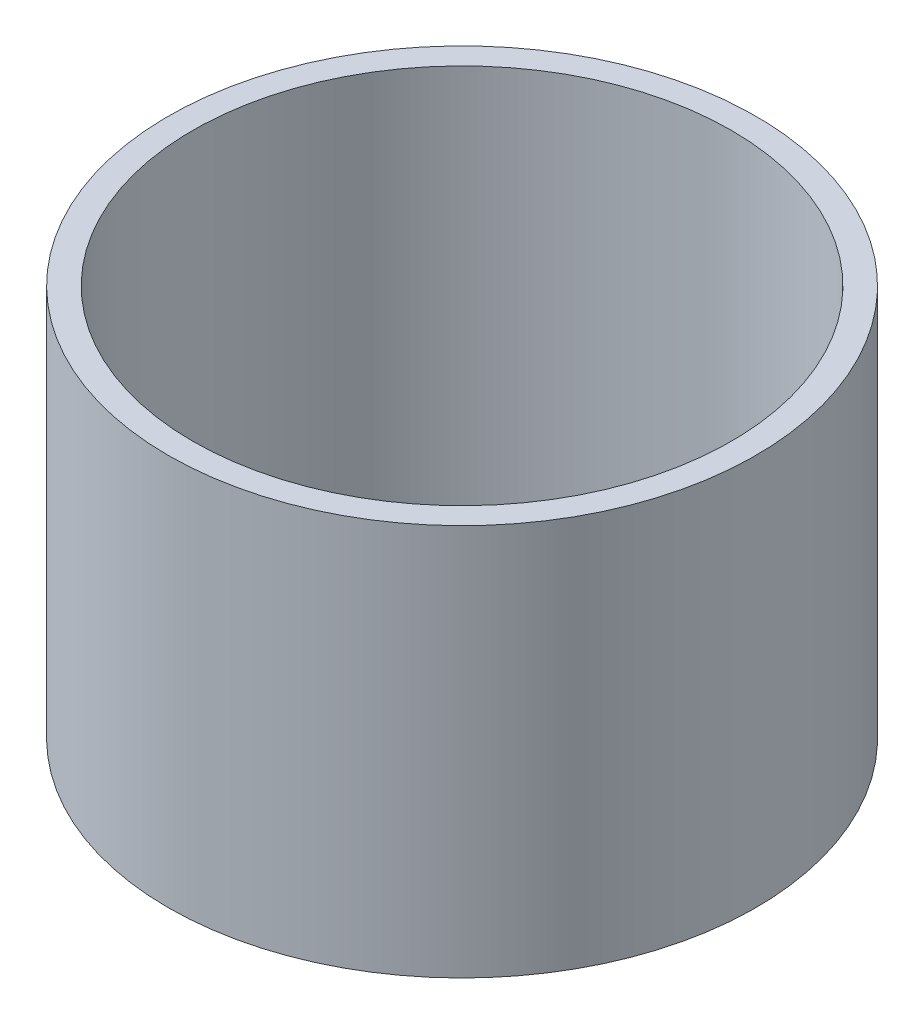
ISO-10303-21;
HEADER;
FILE_DESCRIPTION(('STEP AP214'),'2;1');
FILE_NAME('part.step','',(''),(''),'','','');
FILE_SCHEMA(('AUTOMOTIVE_DESIGN { 1 0 10303 214 1 1 1 1 }'));
ENDSEC;
DATA;
#1=APPLICATION_CONTEXT('core data for automotive mechanical design processes');
#2=APPLICATION_PROTOCOL_DEFINITION('international standard','automotive_design',2000,#1);
#3=PRODUCT_CONTEXT('',#1,'mechanical');
#4=PRODUCT('Part','Part','',(#3));
#5=PRODUCT_RELATED_PRODUCT_CATEGORY('part','',(#4));
#6=PRODUCT_DEFINITION_FORMATION('','',#4);
#7=PRODUCT_DEFINITION_CONTEXT('part definition',#1,'design');
#8=PRODUCT_DEFINITION('design','',#6,#7);
#9=PRODUCT_DEFINITION_SHAPE('','',#8);
#10=(LENGTH_UNIT() NAMED_UNIT(*) SI_UNIT(.MILLI.,.METRE.));
#11=(NAMED_UNIT(*) PLANE_ANGLE_UNIT() SI_UNIT($,.RADIAN.));
#12=(NAMED_UNIT(*) SI_UNIT($,.STERADIAN.) SOLID_ANGLE_UNIT());
#13=UNCERTAINTY_MEASURE_WITH_UNIT(LENGTH_MEASURE(1.E-05),#10,'distance_accuracy_value','');
#14=(GEOMETRIC_REPRESENTATION_CONTEXT(3) GLOBAL_UNCERTAINTY_ASSIGNED_CONTEXT((#13)) GLOBAL_UNIT_ASSIGNED_CONTEXT((#10,
#11,#12)) REPRESENTATION_CONTEXT('',''));
#15=CARTESIAN_POINT('',(0.,0.,0.));
#16=DIRECTION('',(0.,0.,1.));
#17=DIRECTION('',(1.,0.,0.));
#18=AXIS2_PLACEMENT_3D('',#15,#16,#17);
#19=CARTESIAN_POINT('',(0.,80.,0.));
#20=DIRECTION('',(0.,1.,0.));
#21=DIRECTION('',(0.,0.,1.));
#22=AXIS2_PLACEMENT_3D('',#19,#20,#21);
#23=PLANE('',#22);
#24=CARTESIAN_POINT('',(0.,80.,0.));
#25=DIRECTION('',(0.,1.,0.));
#26=DIRECTION('',(0.,0.,1.));
#27=AXIS2_PLACEMENT_3D('',#24,#25,#26);
#28=CIRCLE('',#27,60.);
#29=CARTESIAN_POINT('',(0.,80.,60.));
#30=VERTEX_POINT('',#29);
#31=EDGE_CURVE('E10',#30,#30,#28,.T.);
#32=ORIENTED_EDGE('',*,*,#31,.T.);
#33=EDGE_LOOP('',(#32));
#34=FACE_BOUND('',#33,.T.);
#35=CARTESIAN_POINT('',(0.,80.,0.));
#36=DIRECTION('',(0.,1.,0.));
#37=DIRECTION('',(0.,0.,1.));
#38=AXIS2_PLACEMENT_3D('',#35,#36,#37);
#39=CIRCLE('',#38,55.);
#40=CARTESIAN_POINT('',(0.,80.,55.));
#41=VERTEX_POINT('',#40);
#42=EDGE_CURVE('E42',#41,#41,#39,.T.);
#43=ORIENTED_EDGE('',*,*,#42,.F.);
#44=EDGE_LOOP('',(#43));
#45=FACE_BOUND('',#44,.T.);
#46=ADVANCED_FACE('F31',(#34,#45),#23,.T.);
#47=CARTESIAN_POINT('',(0.,0.,0.));
#48=DIRECTION('',(0.,1.,0.));
#49=DIRECTION('',(0.,0.,1.));
#50=AXIS2_PLACEMENT_3D('',#47,#48,#49);
#51=PLANE('',#50);
#52=CARTESIAN_POINT('',(0.,0.,0.));
#53=DIRECTION('',(0.,1.,0.));
#54=DIRECTION('',(0.,0.,1.));
#55=AXIS2_PLACEMENT_3D('',#52,#53,#54);
#56=CIRCLE('',#55,60.);
#57=CARTESIAN_POINT('',(0.,0.,60.));
#58=VERTEX_POINT('',#57);
#59=EDGE_CURVE('E35',#58,#58,#56,.T.);
#60=ORIENTED_EDGE('',*,*,#59,.F.);
#61=EDGE_LOOP('',(#60));
#62=FACE_BOUND('',#61,.T.);
#63=CARTESIAN_POINT('',(0.,0.,0.));
#64=DIRECTION('',(0.,1.,0.));
#65=DIRECTION('',(0.,0.,1.));
#66=AXIS2_PLACEMENT_3D('',#63,#64,#65);
#67=CIRCLE('',#66,55.);
#68=CARTESIAN_POINT('',(0.,0.,55.));
#69=VERTEX_POINT('',#68);
#70=EDGE_CURVE('E44',#69,#69,#67,.T.);
#71=ORIENTED_EDGE('',*,*,#70,.T.);
#72=EDGE_LOOP('',(#71));
#73=FACE_BOUND('',#72,.T.);
#74=ADVANCED_FACE('F54',(#62,#73),#51,.F.);
#75=CARTESIAN_POINT('',(0.,80.,0.));
#76=DIRECTION('',(0.,-1.,0.));
#77=DIRECTION('',(0.,0.,-1.));
#78=AXIS2_PLACEMENT_3D('',#75,#76,#77);
#79=CYLINDRICAL_SURFACE('',#78,60.);
#80=ORIENTED_EDGE('',*,*,#31,.F.);
#81=EDGE_LOOP('',(#80));
#82=FACE_BOUND('',#81,.T.);
#83=ORIENTED_EDGE('',*,*,#59,.T.);
#84=EDGE_LOOP('',(#83));
#85=FACE_BOUND('',#84,.T.);
#86=ADVANCED_FACE('F33',(#82,#85),#79,.T.);
#87=CARTESIAN_POINT('',(0.,80.,0.));
#88=DIRECTION('',(0.,-1.,0.));
#89=DIRECTION('',(0.,0.,-1.));
#90=AXIS2_PLACEMENT_3D('',#87,#88,#89);
#91=CYLINDRICAL_SURFACE('',#90,55.);
#92=ORIENTED_EDGE('',*,*,#42,.T.);
#93=EDGE_LOOP('',(#92));
#94=FACE_BOUND('',#93,.T.);
#95=ORIENTED_EDGE('',*,*,#70,.F.);
#96=EDGE_LOOP('',(#95));
#97=FACE_BOUND('',#96,.T.);
#98=ADVANCED_FACE('F50',(#94,#97),#91,.F.);
#99=CLOSED_SHELL('',(#46,#74,#86,#98));
#100=MANIFOLD_SOLID_BREP('B2',#99);
#101=ADVANCED_BREP_SHAPE_REPRESENTATION('',(#18,#100),#14);
#102=SHAPE_DEFINITION_REPRESENTATION(#9,#101);
ENDSEC;
END-ISO-10303-21;
